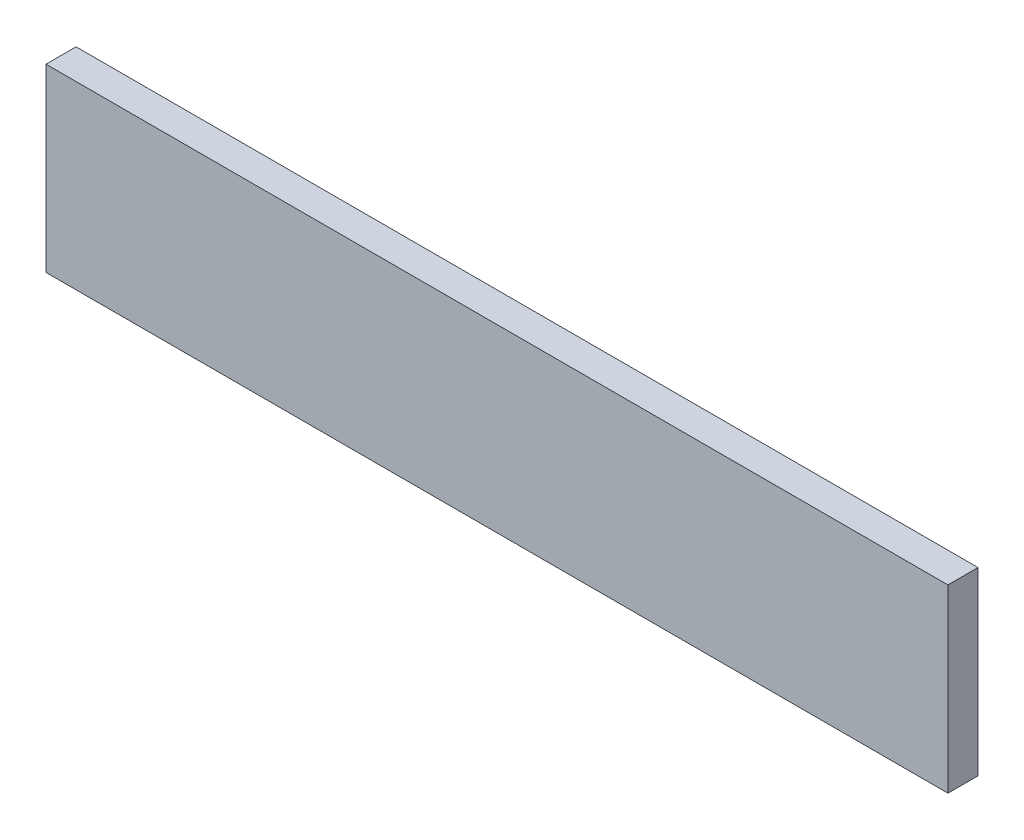
ISO-10303-21;
HEADER;
FILE_DESCRIPTION(('STEP AP214'),'2;1');
FILE_NAME('part.step','',(''),(''),'','','');
FILE_SCHEMA(('AUTOMOTIVE_DESIGN { 1 0 10303 214 1 1 1 1 }'));
ENDSEC;
DATA;
#1=APPLICATION_CONTEXT('core data for automotive mechanical design processes');
#2=APPLICATION_PROTOCOL_DEFINITION('international standard','automotive_design',2000,#1);
#3=PRODUCT_CONTEXT('',#1,'mechanical');
#4=PRODUCT('Part','Part','',(#3));
#5=PRODUCT_RELATED_PRODUCT_CATEGORY('part','',(#4));
#6=PRODUCT_DEFINITION_FORMATION('','',#4);
#7=PRODUCT_DEFINITION_CONTEXT('part definition',#1,'design');
#8=PRODUCT_DEFINITION('design','',#6,#7);
#9=PRODUCT_DEFINITION_SHAPE('','',#8);
#10=(LENGTH_UNIT() NAMED_UNIT(*) SI_UNIT(.MILLI.,.METRE.));
#11=(NAMED_UNIT(*) PLANE_ANGLE_UNIT() SI_UNIT($,.RADIAN.));
#12=(NAMED_UNIT(*) SI_UNIT($,.STERADIAN.) SOLID_ANGLE_UNIT());
#13=UNCERTAINTY_MEASURE_WITH_UNIT(LENGTH_MEASURE(1.E-05),#10,'distance_accuracy_value','');
#14=(GEOMETRIC_REPRESENTATION_CONTEXT(3) GLOBAL_UNCERTAINTY_ASSIGNED_CONTEXT((#13)) GLOBAL_UNIT_ASSIGNED_CONTEXT((#10,
#11,#12)) REPRESENTATION_CONTEXT('',''));
#15=CARTESIAN_POINT('',(0.,0.,0.));
#16=DIRECTION('',(0.,0.,1.));
#17=DIRECTION('',(1.,0.,0.));
#18=AXIS2_PLACEMENT_3D('',#15,#16,#17);
#19=CARTESIAN_POINT('',(0.,0.,10.));
#20=DIRECTION('',(1.,0.,0.));
#21=DIRECTION('',(0.,0.,-1.));
#22=AXIS2_PLACEMENT_3D('',#19,#20,#21);
#23=PLANE('',#22);
#24=DIRECTION('',(0.,-1.,0.));
#25=VECTOR('',#24,1.);
#26=CARTESIAN_POINT('',(0.,0.,0.));
#27=LINE('',#26,#25);
#28=CARTESIAN_POINT('',(0.,60.,0.));
#29=VERTEX_POINT('',#28);
#30=CARTESIAN_POINT('',(0.,0.,0.));
#31=VERTEX_POINT('',#30);
#32=EDGE_CURVE('E96',#29,#31,#27,.T.);
#33=ORIENTED_EDGE('',*,*,#32,.T.);
#34=DIRECTION('',(0.,0.,-1.));
#35=VECTOR('',#34,1.);
#36=CARTESIAN_POINT('',(0.,0.,10.));
#37=LINE('',#36,#35);
#38=CARTESIAN_POINT('',(0.,0.,10.));
#39=VERTEX_POINT('',#38);
#40=EDGE_CURVE('E11',#39,#31,#37,.T.);
#41=ORIENTED_EDGE('',*,*,#40,.F.);
#42=DIRECTION('',(0.,-1.,0.));
#43=VECTOR('',#42,1.);
#44=CARTESIAN_POINT('',(0.,0.,10.));
#45=LINE('',#44,#43);
#46=CARTESIAN_POINT('',(0.,60.,10.));
#47=VERTEX_POINT('',#46);
#48=EDGE_CURVE('E84',#47,#39,#45,.T.);
#49=ORIENTED_EDGE('',*,*,#48,.F.);
#50=DIRECTION('',(0.,0.,-1.));
#51=VECTOR('',#50,1.);
#52=CARTESIAN_POINT('',(0.,60.,10.));
#53=LINE('',#52,#51);
#54=EDGE_CURVE('E92',#47,#29,#53,.T.);
#55=ORIENTED_EDGE('',*,*,#54,.T.);
#56=EDGE_LOOP('',(#33,#41,#49,#55));
#57=FACE_BOUND('',#56,.T.);
#58=ADVANCED_FACE('F33',(#57),#23,.F.);
#59=CARTESIAN_POINT('',(0.,0.,10.));
#60=DIRECTION('',(0.,1.,0.));
#61=DIRECTION('',(0.,0.,1.));
#62=AXIS2_PLACEMENT_3D('',#59,#60,#61);
#63=PLANE('',#62);
#64=DIRECTION('',(1.,0.,0.));
#65=VECTOR('',#64,1.);
#66=CARTESIAN_POINT('',(0.,0.,0.));
#67=LINE('',#66,#65);
#68=CARTESIAN_POINT('',(300.,0.,0.));
#69=VERTEX_POINT('',#68);
#70=EDGE_CURVE('E88',#31,#69,#67,.T.);
#71=ORIENTED_EDGE('',*,*,#70,.T.);
#72=DIRECTION('',(0.,0.,-1.));
#73=VECTOR('',#72,1.);
#74=CARTESIAN_POINT('',(300.,0.,10.));
#75=LINE('',#74,#73);
#76=CARTESIAN_POINT('',(300.,0.,10.));
#77=VERTEX_POINT('',#76);
#78=EDGE_CURVE('E41',#77,#69,#75,.T.);
#79=ORIENTED_EDGE('',*,*,#78,.F.);
#80=DIRECTION('',(1.,0.,0.));
#81=VECTOR('',#80,1.);
#82=CARTESIAN_POINT('',(0.,0.,10.));
#83=LINE('',#82,#81);
#84=EDGE_CURVE('E79',#39,#77,#83,.T.);
#85=ORIENTED_EDGE('',*,*,#84,.F.);
#86=ORIENTED_EDGE('',*,*,#40,.T.);
#87=EDGE_LOOP('',(#71,#79,#85,#86));
#88=FACE_BOUND('',#87,.T.);
#89=ADVANCED_FACE('F87',(#88),#63,.F.);
#90=CARTESIAN_POINT('',(300.,0.,10.));
#91=DIRECTION('',(-1.,0.,0.));
#92=DIRECTION('',(0.,0.,1.));
#93=AXIS2_PLACEMENT_3D('',#90,#91,#92);
#94=PLANE('',#93);
#95=DIRECTION('',(0.,1.,0.));
#96=VECTOR('',#95,1.);
#97=CARTESIAN_POINT('',(300.,0.,0.));
#98=LINE('',#97,#96);
#99=CARTESIAN_POINT('',(300.,60.,0.));
#100=VERTEX_POINT('',#99);
#101=EDGE_CURVE('E66',#69,#100,#98,.T.);
#102=ORIENTED_EDGE('',*,*,#101,.T.);
#103=DIRECTION('',(0.,0.,-1.));
#104=VECTOR('',#103,1.);
#105=CARTESIAN_POINT('',(300.,60.,10.));
#106=LINE('',#105,#104);
#107=CARTESIAN_POINT('',(300.,60.,10.));
#108=VERTEX_POINT('',#107);
#109=EDGE_CURVE('E89',#108,#100,#106,.T.);
#110=ORIENTED_EDGE('',*,*,#109,.F.);
#111=DIRECTION('',(0.,1.,0.));
#112=VECTOR('',#111,1.);
#113=CARTESIAN_POINT('',(300.,0.,10.));
#114=LINE('',#113,#112);
#115=EDGE_CURVE('E82',#77,#108,#114,.T.);
#116=ORIENTED_EDGE('',*,*,#115,.F.);
#117=ORIENTED_EDGE('',*,*,#78,.T.);
#118=EDGE_LOOP('',(#102,#110,#116,#117));
#119=FACE_BOUND('',#118,.T.);
#120=ADVANCED_FACE('F90',(#119),#94,.F.);
#121=CARTESIAN_POINT('',(0.,60.,10.));
#122=DIRECTION('',(0.,-1.,0.));
#123=DIRECTION('',(0.,0.,-1.));
#124=AXIS2_PLACEMENT_3D('',#121,#122,#123);
#125=PLANE('',#124);
#126=DIRECTION('',(-1.,0.,0.));
#127=VECTOR('',#126,1.);
#128=CARTESIAN_POINT('',(0.,60.,0.));
#129=LINE('',#128,#127);
#130=EDGE_CURVE('E72',#100,#29,#129,.T.);
#131=ORIENTED_EDGE('',*,*,#130,.T.);
#132=ORIENTED_EDGE('',*,*,#54,.F.);
#133=DIRECTION('',(-1.,0.,0.));
#134=VECTOR('',#133,1.);
#135=CARTESIAN_POINT('',(0.,60.,10.));
#136=LINE('',#135,#134);
#137=EDGE_CURVE('E49',#108,#47,#136,.T.);
#138=ORIENTED_EDGE('',*,*,#137,.F.);
#139=ORIENTED_EDGE('',*,*,#109,.T.);
#140=EDGE_LOOP('',(#131,#132,#138,#139));
#141=FACE_BOUND('',#140,.T.);
#142=ADVANCED_FACE('F103',(#141),#125,.F.);
#143=CARTESIAN_POINT('',(0.,0.,10.));
#144=DIRECTION('',(0.,0.,-1.));
#145=DIRECTION('',(-1.,0.,0.));
#146=AXIS2_PLACEMENT_3D('',#143,#144,#145);
#147=PLANE('',#146);
#148=ORIENTED_EDGE('',*,*,#48,.T.);
#149=ORIENTED_EDGE('',*,*,#84,.T.);
#150=ORIENTED_EDGE('',*,*,#115,.T.);
#151=ORIENTED_EDGE('',*,*,#137,.T.);
#152=EDGE_LOOP('',(#148,#149,#150,#151));
#153=FACE_BOUND('',#152,.T.);
#154=ADVANCED_FACE('F80',(#153),#147,.F.);
#155=CARTESIAN_POINT('',(0.,0.,0.));
#156=DIRECTION('',(0.,0.,-1.));
#157=DIRECTION('',(-1.,0.,0.));
#158=AXIS2_PLACEMENT_3D('',#155,#156,#157);
#159=PLANE('',#158);
#160=ORIENTED_EDGE('',*,*,#32,.F.);
#161=ORIENTED_EDGE('',*,*,#130,.F.);
#162=ORIENTED_EDGE('',*,*,#101,.F.);
#163=ORIENTED_EDGE('',*,*,#70,.F.);
#164=EDGE_LOOP('',(#160,#161,#162,#163));
#165=FACE_BOUND('',#164,.T.);
#166=ADVANCED_FACE('F106',(#165),#159,.T.);
#167=CLOSED_SHELL('',(#58,#89,#120,#142,#154,#166));
#168=MANIFOLD_SOLID_BREP('B2',#167);
#169=ADVANCED_BREP_SHAPE_REPRESENTATION('',(#18,#168),#14);
#170=SHAPE_DEFINITION_REPRESENTATION(#9,#169);
ENDSEC;
END-ISO-10303-21;
